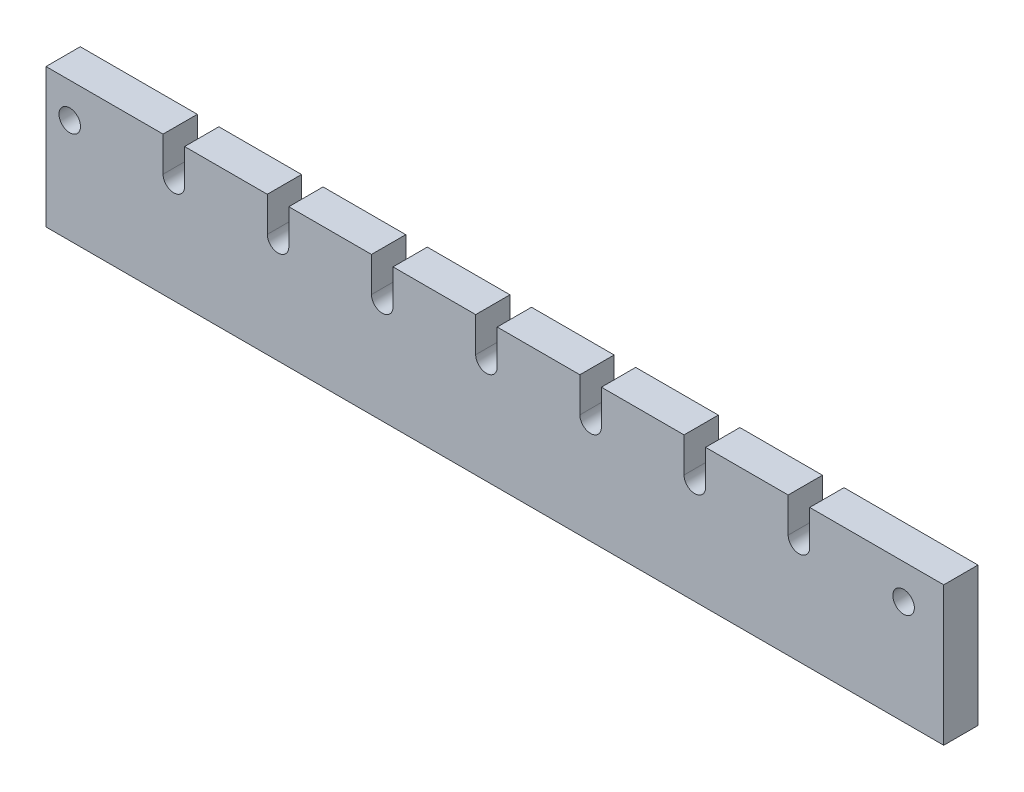
ISO-10303-21;
HEADER;
FILE_DESCRIPTION(('STEP AP214'),'2;1');
FILE_NAME('part.step','',(''),(''),'','','');
FILE_SCHEMA(('AUTOMOTIVE_DESIGN { 1 0 10303 214 1 1 1 1 }'));
ENDSEC;
DATA;
#1=APPLICATION_CONTEXT('core data for automotive mechanical design processes');
#2=APPLICATION_PROTOCOL_DEFINITION('international standard','automotive_design',2000,#1);
#3=PRODUCT_CONTEXT('',#1,'mechanical');
#4=PRODUCT('Part','Part','',(#3));
#5=PRODUCT_RELATED_PRODUCT_CATEGORY('part','',(#4));
#6=PRODUCT_DEFINITION_FORMATION('','',#4);
#7=PRODUCT_DEFINITION_CONTEXT('part definition',#1,'design');
#8=PRODUCT_DEFINITION('design','',#6,#7);
#9=PRODUCT_DEFINITION_SHAPE('','',#8);
#10=(LENGTH_UNIT() NAMED_UNIT(*) SI_UNIT(.MILLI.,.METRE.));
#11=(NAMED_UNIT(*) PLANE_ANGLE_UNIT() SI_UNIT($,.RADIAN.));
#12=(NAMED_UNIT(*) SI_UNIT($,.STERADIAN.) SOLID_ANGLE_UNIT());
#13=UNCERTAINTY_MEASURE_WITH_UNIT(LENGTH_MEASURE(1.E-05),#10,'distance_accuracy_value','');
#14=(GEOMETRIC_REPRESENTATION_CONTEXT(3) GLOBAL_UNCERTAINTY_ASSIGNED_CONTEXT((#13)) GLOBAL_UNIT_ASSIGNED_CONTEXT((#10,
#11,#12)) REPRESENTATION_CONTEXT('',''));
#15=CARTESIAN_POINT('',(0.,0.,0.));
#16=DIRECTION('',(0.,0.,1.));
#17=DIRECTION('',(1.,0.,0.));
#18=AXIS2_PLACEMENT_3D('',#15,#16,#17);
#19=CARTESIAN_POINT('',(-14.535440576,5.65,1.47955));
#20=DIRECTION('',(0.,-1.,0.));
#21=DIRECTION('',(1.,0.,0.));
#22=AXIS2_PLACEMENT_3D('',#19,#20,#21);
#23=PLANE('',#22);
#24=DIRECTION('',(-1.,0.,0.));
#25=VECTOR('',#24,1.);
#26=CARTESIAN_POINT('',(-14.535440576,5.65,-1.47955));
#27=LINE('',#26,#25);
#28=CARTESIAN_POINT('',(-54.948557695701,5.65,-1.47955));
#29=VERTEX_POINT('',#28);
#30=CARTESIAN_POINT('',(-62.0865766914609,5.65,-1.47955));
#31=VERTEX_POINT('',#30);
#32=EDGE_CURVE('E519',#29,#31,#27,.T.);
#33=ORIENTED_EDGE('',*,*,#32,.T.);
#34=DIRECTION('',(0.,0.,-1.));
#35=VECTOR('',#34,1.);
#36=CARTESIAN_POINT('',(-62.0865766914609,5.65,1.47955));
#37=LINE('',#36,#35);
#38=CARTESIAN_POINT('',(-62.0865766914609,5.65,1.47955));
#39=VERTEX_POINT('',#38);
#40=EDGE_CURVE('E331',#39,#31,#37,.T.);
#41=ORIENTED_EDGE('',*,*,#40,.F.);
#42=DIRECTION('',(-1.,0.,0.));
#43=VECTOR('',#42,1.);
#44=CARTESIAN_POINT('',(-14.535440576,5.65,1.47955));
#45=LINE('',#44,#43);
#46=CARTESIAN_POINT('',(-54.948557695701,5.65,1.47955));
#47=VERTEX_POINT('',#46);
#48=EDGE_CURVE('E559',#47,#39,#45,.T.);
#49=ORIENTED_EDGE('',*,*,#48,.F.);
#50=DIRECTION('',(0.,0.,-1.));
#51=VECTOR('',#50,1.);
#52=CARTESIAN_POINT('',(-54.948557695701,5.65,1.47955));
#53=LINE('',#52,#51);
#54=EDGE_CURVE('E309',#47,#29,#53,.T.);
#55=ORIENTED_EDGE('',*,*,#54,.T.);
#56=EDGE_LOOP('',(#33,#41,#49,#55));
#57=FACE_BOUND('',#56,.T.);
#58=ADVANCED_FACE('F43',(#57),#23,.F.);
#59=CARTESIAN_POINT('',(-45.9523375342107,5.65,-1.47955));
#60=VERTEX_POINT('',#59);
#61=CARTESIAN_POINT('',(-53.089277695701,5.65,-1.47955));
#62=VERTEX_POINT('',#61);
#63=EDGE_CURVE('E517',#60,#62,#27,.T.);
#64=ORIENTED_EDGE('',*,*,#63,.T.);
#65=DIRECTION('',(0.,0.,-1.));
#66=VECTOR('',#65,1.);
#67=CARTESIAN_POINT('',(-53.089277695701,5.65,1.47955));
#68=LINE('',#67,#66);
#69=CARTESIAN_POINT('',(-53.089277695701,5.65,1.47955));
#70=VERTEX_POINT('',#69);
#71=EDGE_CURVE('E313',#70,#62,#68,.T.);
#72=ORIENTED_EDGE('',*,*,#71,.F.);
#73=CARTESIAN_POINT('',(-45.9523375342107,5.65,1.47955));
#74=VERTEX_POINT('',#73);
#75=EDGE_CURVE('E511',#74,#70,#45,.T.);
#76=ORIENTED_EDGE('',*,*,#75,.F.);
#77=DIRECTION('',(0.,0.,-1.));
#78=VECTOR('',#77,1.);
#79=CARTESIAN_POINT('',(-45.9523375342107,5.65,1.47955));
#80=LINE('',#79,#78);
#81=EDGE_CURVE('E289',#74,#60,#80,.T.);
#82=ORIENTED_EDGE('',*,*,#81,.T.);
#83=EDGE_LOOP('',(#64,#72,#76,#82));
#84=FACE_BOUND('',#83,.T.);
#85=ADVANCED_FACE('F516',(#84),#23,.F.);
#86=CARTESIAN_POINT('',(-36.9580024401696,5.65,-1.47955));
#87=VERTEX_POINT('',#86);
#88=CARTESIAN_POINT('',(-44.0930575342107,5.65,-1.47955));
#89=VERTEX_POINT('',#88);
#90=EDGE_CURVE('E518',#87,#89,#27,.T.);
#91=ORIENTED_EDGE('',*,*,#90,.T.);
#92=DIRECTION('',(0.,0.,-1.));
#93=VECTOR('',#92,1.);
#94=CARTESIAN_POINT('',(-44.0930575342107,5.65,1.47955));
#95=LINE('',#94,#93);
#96=CARTESIAN_POINT('',(-44.0930575342107,5.65,1.47955));
#97=VERTEX_POINT('',#96);
#98=EDGE_CURVE('E293',#97,#89,#95,.T.);
#99=ORIENTED_EDGE('',*,*,#98,.F.);
#100=CARTESIAN_POINT('',(-36.9580024401696,5.65,1.47955));
#101=VERTEX_POINT('',#100);
#102=EDGE_CURVE('E561',#101,#97,#45,.T.);
#103=ORIENTED_EDGE('',*,*,#102,.F.);
#104=DIRECTION('',(0.,0.,-1.));
#105=VECTOR('',#104,1.);
#106=CARTESIAN_POINT('',(-36.9580024401696,5.65,1.47955));
#107=LINE('',#106,#105);
#108=EDGE_CURVE('E280',#101,#87,#107,.T.);
#109=ORIENTED_EDGE('',*,*,#108,.T.);
#110=EDGE_LOOP('',(#91,#99,#103,#109));
#111=FACE_BOUND('',#110,.T.);
#112=ADVANCED_FACE('F567',(#111),#23,.F.);
#113=CARTESIAN_POINT('',(-27.9674254001458,5.65,-1.47955));
#114=VERTEX_POINT('',#113);
#115=CARTESIAN_POINT('',(-35.0987224401695,5.65,-1.47955));
#116=VERTEX_POINT('',#115);
#117=EDGE_CURVE('E425',#114,#116,#27,.T.);
#118=ORIENTED_EDGE('',*,*,#117,.T.);
#119=DIRECTION('',(0.,0.,-1.));
#120=VECTOR('',#119,1.);
#121=CARTESIAN_POINT('',(-35.0987224401695,5.65,1.47955));
#122=LINE('',#121,#120);
#123=CARTESIAN_POINT('',(-35.0987224401695,5.65,1.47955));
#124=VERTEX_POINT('',#123);
#125=EDGE_CURVE('E257',#124,#116,#122,.T.);
#126=ORIENTED_EDGE('',*,*,#125,.F.);
#127=CARTESIAN_POINT('',(-27.9674254001458,5.65,1.47955));
#128=VERTEX_POINT('',#127);
#129=EDGE_CURVE('E277',#128,#124,#45,.T.);
#130=ORIENTED_EDGE('',*,*,#129,.F.);
#131=DIRECTION('',(0.,0.,-1.));
#132=VECTOR('',#131,1.);
#133=CARTESIAN_POINT('',(-27.9674254001458,5.65,1.47955));
#134=LINE('',#133,#132);
#135=EDGE_CURVE('E350',#128,#114,#134,.T.);
#136=ORIENTED_EDGE('',*,*,#135,.T.);
#137=EDGE_LOOP('',(#118,#126,#130,#136));
#138=FACE_BOUND('',#137,.T.);
#139=ADVANCED_FACE('F616',(#138),#23,.F.);
#140=CARTESIAN_POINT('',(-63.9458566914609,5.65,1.47955));
#141=VERTEX_POINT('',#140);
#142=CARTESIAN_POINT('',(-71.0845505180921,5.65,1.47955));
#143=VERTEX_POINT('',#142);
#144=EDGE_CURVE('E556',#141,#143,#45,.T.);
#145=ORIENTED_EDGE('',*,*,#144,.F.);
#146=DIRECTION('',(0.,0.,-1.));
#147=VECTOR('',#146,1.);
#148=CARTESIAN_POINT('',(-63.9458566914609,5.65,1.47955));
#149=LINE('',#148,#147);
#150=CARTESIAN_POINT('',(-63.9458566914609,5.65,-1.47955));
#151=VERTEX_POINT('',#150);
#152=EDGE_CURVE('E328',#141,#151,#149,.T.);
#153=ORIENTED_EDGE('',*,*,#152,.T.);
#154=CARTESIAN_POINT('',(-71.0845505180921,5.65,-1.47955));
#155=VERTEX_POINT('',#154);
#156=EDGE_CURVE('E522',#151,#155,#27,.T.);
#157=ORIENTED_EDGE('',*,*,#156,.T.);
#158=DIRECTION('',(0.,0.,-1.));
#159=VECTOR('',#158,1.);
#160=CARTESIAN_POINT('',(-71.0845505180921,5.65,1.47955));
#161=LINE('',#160,#159);
#162=EDGE_CURVE('E371',#143,#155,#161,.T.);
#163=ORIENTED_EDGE('',*,*,#162,.F.);
#164=EDGE_LOOP('',(#145,#153,#157,#163));
#165=FACE_BOUND('',#164,.T.);
#166=ADVANCED_FACE('F605',(#165),#23,.F.);
#167=CARTESIAN_POINT('',(-72.9438305180921,5.65,1.47955));
#168=VERTEX_POINT('',#167);
#169=CARTESIAN_POINT('',(-80.0829744503734,5.65,1.47955));
#170=VERTEX_POINT('',#169);
#171=EDGE_CURVE('E554',#168,#170,#45,.T.);
#172=ORIENTED_EDGE('',*,*,#171,.F.);
#173=DIRECTION('',(0.,0.,-1.));
#174=VECTOR('',#173,1.);
#175=CARTESIAN_POINT('',(-72.9438305180921,5.65,1.47955));
#176=LINE('',#175,#174);
#177=CARTESIAN_POINT('',(-72.9438305180921,5.65,-1.47955));
#178=VERTEX_POINT('',#177);
#179=EDGE_CURVE('E367',#168,#178,#176,.T.);
#180=ORIENTED_EDGE('',*,*,#179,.T.);
#181=CARTESIAN_POINT('',(-80.0829744503734,5.65,-1.47955));
#182=VERTEX_POINT('',#181);
#183=EDGE_CURVE('E526',#178,#182,#27,.T.);
#184=ORIENTED_EDGE('',*,*,#183,.T.);
#185=DIRECTION('',(0.,0.,-1.));
#186=VECTOR('',#185,1.);
#187=CARTESIAN_POINT('',(-80.0829744503734,5.65,1.47955));
#188=LINE('',#187,#186);
#189=EDGE_CURVE('E392',#170,#182,#188,.T.);
#190=ORIENTED_EDGE('',*,*,#189,.F.);
#191=EDGE_LOOP('',(#172,#180,#184,#190));
#192=FACE_BOUND('',#191,.T.);
#193=ADVANCED_FACE('F600',(#192),#23,.F.);
#194=CARTESIAN_POINT('',(-14.535440576,5.65,-1.47955));
#195=VERTEX_POINT('',#194);
#196=CARTESIAN_POINT('',(-26.1081454001458,5.65,-1.47955));
#197=VERTEX_POINT('',#196);
#198=EDGE_CURVE('E421',#195,#197,#27,.T.);
#199=ORIENTED_EDGE('',*,*,#198,.T.);
#200=DIRECTION('',(0.,0.,-1.));
#201=VECTOR('',#200,1.);
#202=CARTESIAN_POINT('',(-26.1081454001458,5.65,1.47955));
#203=LINE('',#202,#201);
#204=CARTESIAN_POINT('',(-26.1081454001458,5.65,1.47955));
#205=VERTEX_POINT('',#204);
#206=EDGE_CURVE('E353',#205,#197,#203,.T.);
#207=ORIENTED_EDGE('',*,*,#206,.F.);
#208=CARTESIAN_POINT('',(-14.535440576,5.65,1.47955));
#209=VERTEX_POINT('',#208);
#210=EDGE_CURVE('E408',#209,#205,#45,.T.);
#211=ORIENTED_EDGE('',*,*,#210,.F.);
#212=DIRECTION('',(0.,0.,-1.));
#213=VECTOR('',#212,1.);
#214=CARTESIAN_POINT('',(-14.535440576,5.65,1.47955));
#215=LINE('',#214,#213);
#216=EDGE_CURVE('E436',#209,#195,#215,.T.);
#217=ORIENTED_EDGE('',*,*,#216,.T.);
#218=EDGE_LOOP('',(#199,#207,#211,#217));
#219=FACE_BOUND('',#218,.T.);
#220=ADVANCED_FACE('F593',(#219),#23,.F.);
#221=CARTESIAN_POINT('',(-14.535440576,-6.35,1.47955));
#222=DIRECTION('',(-1.,0.,0.));
#223=DIRECTION('',(0.,-1.,0.));
#224=AXIS2_PLACEMENT_3D('',#221,#222,#223);
#225=PLANE('',#224);
#226=DIRECTION('',(0.,1.,0.));
#227=VECTOR('',#226,1.);
#228=CARTESIAN_POINT('',(-14.535440576,-6.35,-1.47955));
#229=LINE('',#228,#227);
#230=CARTESIAN_POINT('',(-14.535440576,-6.35,-1.47955));
#231=VERTEX_POINT('',#230);
#232=EDGE_CURVE('E416',#231,#195,#229,.T.);
#233=ORIENTED_EDGE('',*,*,#232,.T.);
#234=ORIENTED_EDGE('',*,*,#216,.F.);
#235=DIRECTION('',(0.,1.,0.));
#236=VECTOR('',#235,1.);
#237=CARTESIAN_POINT('',(-14.535440576,-6.35,1.47955));
#238=LINE('',#237,#236);
#239=CARTESIAN_POINT('',(-14.535440576,-6.35,1.47955));
#240=VERTEX_POINT('',#239);
#241=EDGE_CURVE('E403',#240,#209,#238,.T.);
#242=ORIENTED_EDGE('',*,*,#241,.F.);
#243=DIRECTION('',(0.,0.,-1.));
#244=VECTOR('',#243,1.);
#245=CARTESIAN_POINT('',(-14.535440576,-6.35,1.47955));
#246=LINE('',#245,#244);
#247=EDGE_CURVE('E415',#240,#231,#246,.T.);
#248=ORIENTED_EDGE('',*,*,#247,.T.);
#249=EDGE_LOOP('',(#233,#234,#242,#248));
#250=FACE_BOUND('',#249,.T.);
#251=ADVANCED_FACE('F45',(#250),#225,.F.);
#252=CARTESIAN_POINT('',(-81.9422544503734,5.64999999999999,1.47955));
#253=VERTEX_POINT('',#252);
#254=CARTESIAN_POINT('',(-92.050002844,5.64999999999999,1.47955));
#255=VERTEX_POINT('',#254);
#256=EDGE_CURVE('E406',#253,#255,#45,.T.);
#257=ORIENTED_EDGE('',*,*,#256,.F.);
#258=DIRECTION('',(0.,0.,-1.));
#259=VECTOR('',#258,1.);
#260=CARTESIAN_POINT('',(-81.9422544503734,5.64999999999999,1.47955));
#261=LINE('',#260,#259);
#262=CARTESIAN_POINT('',(-81.9422544503734,5.64999999999999,-1.47955));
#263=VERTEX_POINT('',#262);
#264=EDGE_CURVE('E389',#253,#263,#261,.T.);
#265=ORIENTED_EDGE('',*,*,#264,.T.);
#266=CARTESIAN_POINT('',(-92.050002844,5.64999999999999,-1.47955));
#267=VERTEX_POINT('',#266);
#268=EDGE_CURVE('E419',#263,#267,#27,.T.);
#269=ORIENTED_EDGE('',*,*,#268,.T.);
#270=DIRECTION('',(0.,0.,-1.));
#271=VECTOR('',#270,1.);
#272=CARTESIAN_POINT('',(-92.050002844,5.64999999999999,1.47955));
#273=LINE('',#272,#271);
#274=EDGE_CURVE('E433',#255,#267,#273,.T.);
#275=ORIENTED_EDGE('',*,*,#274,.F.);
#276=EDGE_LOOP('',(#257,#265,#269,#275));
#277=FACE_BOUND('',#276,.T.);
#278=ADVANCED_FACE('F538',(#277),#23,.F.);
#279=CARTESIAN_POINT('',(-92.050002844,-6.35000000000001,1.47955));
#280=DIRECTION('',(1.,0.,0.));
#281=DIRECTION('',(0.,0.,-1.));
#282=AXIS2_PLACEMENT_3D('',#279,#280,#281);
#283=PLANE('',#282);
#284=DIRECTION('',(0.,-1.,0.));
#285=VECTOR('',#284,1.);
#286=CARTESIAN_POINT('',(-92.050002844,-6.35000000000001,-1.47955));
#287=LINE('',#286,#285);
#288=CARTESIAN_POINT('',(-92.050002844,-6.35000000000001,-1.47955));
#289=VERTEX_POINT('',#288);
#290=EDGE_CURVE('E424',#267,#289,#287,.T.);
#291=ORIENTED_EDGE('',*,*,#290,.T.);
#292=DIRECTION('',(0.,0.,-1.));
#293=VECTOR('',#292,1.);
#294=CARTESIAN_POINT('',(-92.050002844,-6.35000000000001,1.47955));
#295=LINE('',#294,#293);
#296=CARTESIAN_POINT('',(-92.050002844,-6.35000000000001,1.47955));
#297=VERTEX_POINT('',#296);
#298=EDGE_CURVE('E430',#297,#289,#295,.T.);
#299=ORIENTED_EDGE('',*,*,#298,.F.);
#300=DIRECTION('',(0.,-1.,0.));
#301=VECTOR('',#300,1.);
#302=CARTESIAN_POINT('',(-92.050002844,-6.35000000000001,1.47955));
#303=LINE('',#302,#301);
#304=EDGE_CURVE('E411',#255,#297,#303,.T.);
#305=ORIENTED_EDGE('',*,*,#304,.F.);
#306=ORIENTED_EDGE('',*,*,#274,.T.);
#307=EDGE_LOOP('',(#291,#299,#305,#306));
#308=FACE_BOUND('',#307,.T.);
#309=ADVANCED_FACE('F542',(#308),#283,.F.);
#310=CARTESIAN_POINT('',(-14.535440576,-6.35,1.47955));
#311=DIRECTION('',(0.,1.,0.));
#312=DIRECTION('',(-1.,0.,0.));
#313=AXIS2_PLACEMENT_3D('',#310,#311,#312);
#314=PLANE('',#313);
#315=DIRECTION('',(1.,0.,0.));
#316=VECTOR('',#315,1.);
#317=CARTESIAN_POINT('',(-14.535440576,-6.35,-1.47955));
#318=LINE('',#317,#316);
#319=EDGE_CURVE('E407',#289,#231,#318,.T.);
#320=ORIENTED_EDGE('',*,*,#319,.T.);
#321=ORIENTED_EDGE('',*,*,#247,.F.);
#322=DIRECTION('',(1.,0.,0.));
#323=VECTOR('',#322,1.);
#324=CARTESIAN_POINT('',(-14.535440576,-6.35,1.47955));
#325=LINE('',#324,#323);
#326=EDGE_CURVE('E413',#297,#240,#325,.T.);
#327=ORIENTED_EDGE('',*,*,#326,.F.);
#328=ORIENTED_EDGE('',*,*,#298,.T.);
#329=EDGE_LOOP('',(#320,#321,#327,#328));
#330=FACE_BOUND('',#329,.T.);
#331=ADVANCED_FACE('F548',(#330),#314,.F.);
#332=CARTESIAN_POINT('',(0.,0.,1.47955));
#333=DIRECTION('',(0.,0.,1.));
#334=DIRECTION('',(1.,0.,0.));
#335=AXIS2_PLACEMENT_3D('',#332,#333,#334);
#336=PLANE('',#335);
#337=CARTESIAN_POINT('',(-18.000000576,2.65,1.47955));
#338=DIRECTION('',(0.,0.,-1.));
#339=DIRECTION('',(-1.,0.,0.));
#340=AXIS2_PLACEMENT_3D('',#337,#338,#339);
#341=CIRCLE('',#340,0.929639999999999);
#342=CARTESIAN_POINT('',(-18.929640576,2.65,1.47955));
#343=VERTEX_POINT('',#342);
#344=EDGE_CURVE('E384',#343,#343,#341,.T.);
#345=ORIENTED_EDGE('',*,*,#344,.T.);
#346=EDGE_LOOP('',(#345));
#347=FACE_BOUND('',#346,.T.);
#348=DIRECTION('',(0.,-1.,0.));
#349=VECTOR('',#348,1.);
#350=CARTESIAN_POINT('',(-62.0865766914609,2.65,1.47955));
#351=LINE('',#350,#349);
#352=CARTESIAN_POINT('',(-62.0865766914609,2.65,1.47955));
#353=VERTEX_POINT('',#352);
#354=EDGE_CURVE('E327',#39,#353,#351,.T.);
#355=ORIENTED_EDGE('',*,*,#354,.T.);
#356=CARTESIAN_POINT('',(-63.0162166914609,2.65,1.47955));
#357=DIRECTION('',(0.,0.,-1.));
#358=DIRECTION('',(-1.,0.,0.));
#359=AXIS2_PLACEMENT_3D('',#356,#357,#358);
#360=CIRCLE('',#359,0.929639999999999);
#361=CARTESIAN_POINT('',(-63.9458566914609,2.65,1.47955));
#362=VERTEX_POINT('',#361);
#363=EDGE_CURVE('E314',#353,#362,#360,.T.);
#364=ORIENTED_EDGE('',*,*,#363,.T.);
#365=DIRECTION('',(0.,1.,0.));
#366=VECTOR('',#365,1.);
#367=CARTESIAN_POINT('',(-63.9458566914609,5.65,1.47955));
#368=LINE('',#367,#366);
#369=EDGE_CURVE('E336',#362,#141,#368,.T.);
#370=ORIENTED_EDGE('',*,*,#369,.T.);
#371=ORIENTED_EDGE('',*,*,#144,.T.);
#372=DIRECTION('',(0.,-1.,0.));
#373=VECTOR('',#372,1.);
#374=CARTESIAN_POINT('',(-71.0845505180921,2.65,1.47955));
#375=LINE('',#374,#373);
#376=CARTESIAN_POINT('',(-71.0845505180921,2.65,1.47955));
#377=VERTEX_POINT('',#376);
#378=EDGE_CURVE('E366',#143,#377,#375,.T.);
#379=ORIENTED_EDGE('',*,*,#378,.T.);
#380=CARTESIAN_POINT('',(-72.0141905180921,2.65,1.47955));
#381=DIRECTION('',(0.,0.,-1.));
#382=DIRECTION('',(-1.,0.,0.));
#383=AXIS2_PLACEMENT_3D('',#380,#381,#382);
#384=CIRCLE('',#383,0.929639999999995);
#385=CARTESIAN_POINT('',(-72.9438305180921,2.65,1.47955));
#386=VERTEX_POINT('',#385);
#387=EDGE_CURVE('E381',#377,#386,#384,.T.);
#388=ORIENTED_EDGE('',*,*,#387,.T.);
#389=DIRECTION('',(0.,1.,0.));
#390=VECTOR('',#389,1.);
#391=CARTESIAN_POINT('',(-72.9438305180921,5.65,1.47955));
#392=LINE('',#391,#390);
#393=EDGE_CURVE('E378',#386,#168,#392,.T.);
#394=ORIENTED_EDGE('',*,*,#393,.T.);
#395=ORIENTED_EDGE('',*,*,#171,.T.);
#396=DIRECTION('',(0.,-1.,0.));
#397=VECTOR('',#396,1.);
#398=CARTESIAN_POINT('',(-80.0829744503734,2.65,1.47955));
#399=LINE('',#398,#397);
#400=CARTESIAN_POINT('',(-80.0829744503734,2.65,1.47955));
#401=VERTEX_POINT('',#400);
#402=EDGE_CURVE('E388',#170,#401,#399,.T.);
#403=ORIENTED_EDGE('',*,*,#402,.T.);
#404=CARTESIAN_POINT('',(-81.0126144503734,2.65,1.47955));
#405=DIRECTION('',(0.,0.,-1.));
#406=DIRECTION('',(-1.,0.,0.));
#407=AXIS2_PLACEMENT_3D('',#404,#405,#406);
#408=CIRCLE('',#407,0.929639999999995);
#409=CARTESIAN_POINT('',(-81.9422544503734,2.65,1.47955));
#410=VERTEX_POINT('',#409);
#411=EDGE_CURVE('E372',#401,#410,#408,.T.);
#412=ORIENTED_EDGE('',*,*,#411,.T.);
#413=DIRECTION('',(0.,1.,0.));
#414=VECTOR('',#413,1.);
#415=CARTESIAN_POINT('',(-81.9422544503734,5.64999999999999,1.47955));
#416=LINE('',#415,#414);
#417=EDGE_CURVE('E398',#410,#253,#416,.T.);
#418=ORIENTED_EDGE('',*,*,#417,.T.);
#419=ORIENTED_EDGE('',*,*,#256,.T.);
#420=ORIENTED_EDGE('',*,*,#304,.T.);
#421=ORIENTED_EDGE('',*,*,#326,.T.);
#422=ORIENTED_EDGE('',*,*,#241,.T.);
#423=ORIENTED_EDGE('',*,*,#210,.T.);
#424=DIRECTION('',(0.,-1.,0.));
#425=VECTOR('',#424,1.);
#426=CARTESIAN_POINT('',(-26.1081454001458,2.65,1.47955));
#427=LINE('',#426,#425);
#428=CARTESIAN_POINT('',(-26.1081454001458,2.65,1.47955));
#429=VERTEX_POINT('',#428);
#430=EDGE_CURVE('E349',#205,#429,#427,.T.);
#431=ORIENTED_EDGE('',*,*,#430,.T.);
#432=CARTESIAN_POINT('',(-27.0377854001458,2.65,1.47955));
#433=DIRECTION('',(0.,0.,-1.));
#434=DIRECTION('',(-1.,0.,0.));
#435=AXIS2_PLACEMENT_3D('',#432,#433,#434);
#436=CIRCLE('',#435,0.929639999999999);
#437=CARTESIAN_POINT('',(-27.9674254001458,2.65,1.47955));
#438=VERTEX_POINT('',#437);
#439=EDGE_CURVE('E345',#429,#438,#436,.T.);
#440=ORIENTED_EDGE('',*,*,#439,.T.);
#441=DIRECTION('',(0.,1.,0.));
#442=VECTOR('',#441,1.);
#443=CARTESIAN_POINT('',(-27.9674254001458,5.65,1.47955));
#444=LINE('',#443,#442);
#445=EDGE_CURVE('E359',#438,#128,#444,.T.);
#446=ORIENTED_EDGE('',*,*,#445,.T.);
#447=ORIENTED_EDGE('',*,*,#129,.T.);
#448=DIRECTION('',(0.,-1.,0.));
#449=VECTOR('',#448,1.);
#450=CARTESIAN_POINT('',(-35.0987224401695,2.65,1.47955));
#451=LINE('',#450,#449);
#452=CARTESIAN_POINT('',(-35.0987224401695,2.65,1.47955));
#453=VERTEX_POINT('',#452);
#454=EDGE_CURVE('E251',#124,#453,#451,.T.);
#455=ORIENTED_EDGE('',*,*,#454,.T.);
#456=CARTESIAN_POINT('',(-36.0283624401695,2.65,1.47955));
#457=DIRECTION('',(0.,0.,-1.));
#458=DIRECTION('',(-1.,0.,0.));
#459=AXIS2_PLACEMENT_3D('',#456,#457,#458);
#460=CIRCLE('',#459,0.929640000000002);
#461=CARTESIAN_POINT('',(-36.9580024401696,2.65,1.47955));
#462=VERTEX_POINT('',#461);
#463=EDGE_CURVE('E261',#453,#462,#460,.T.);
#464=ORIENTED_EDGE('',*,*,#463,.T.);
#465=DIRECTION('',(0.,1.,0.));
#466=VECTOR('',#465,1.);
#467=CARTESIAN_POINT('',(-36.9580024401696,5.65,1.47955));
#468=LINE('',#467,#466);
#469=EDGE_CURVE('E269',#462,#101,#468,.T.);
#470=ORIENTED_EDGE('',*,*,#469,.T.);
#471=ORIENTED_EDGE('',*,*,#102,.T.);
#472=DIRECTION('',(0.,-1.,0.));
#473=VECTOR('',#472,1.);
#474=CARTESIAN_POINT('',(-44.0930575342107,2.65,1.47955));
#475=LINE('',#474,#473);
#476=CARTESIAN_POINT('',(-44.0930575342107,2.65,1.47955));
#477=VERTEX_POINT('',#476);
#478=EDGE_CURVE('E288',#97,#477,#475,.T.);
#479=ORIENTED_EDGE('',*,*,#478,.T.);
#480=CARTESIAN_POINT('',(-45.0226975342107,2.65,1.47955));
#481=DIRECTION('',(0.,0.,-1.));
#482=DIRECTION('',(-1.,0.,0.));
#483=AXIS2_PLACEMENT_3D('',#480,#481,#482);
#484=CIRCLE('',#483,0.929640000000002);
#485=CARTESIAN_POINT('',(-45.9523375342107,2.65,1.47955));
#486=VERTEX_POINT('',#485);
#487=EDGE_CURVE('E258',#477,#486,#484,.T.);
#488=ORIENTED_EDGE('',*,*,#487,.T.);
#489=DIRECTION('',(0.,1.,0.));
#490=VECTOR('',#489,1.);
#491=CARTESIAN_POINT('',(-45.9523375342107,5.65,1.47955));
#492=LINE('',#491,#490);
#493=EDGE_CURVE('E300',#486,#74,#492,.T.);
#494=ORIENTED_EDGE('',*,*,#493,.T.);
#495=ORIENTED_EDGE('',*,*,#75,.T.);
#496=DIRECTION('',(0.,-1.,0.));
#497=VECTOR('',#496,1.);
#498=CARTESIAN_POINT('',(-53.089277695701,2.65,1.47955));
#499=LINE('',#498,#497);
#500=CARTESIAN_POINT('',(-53.089277695701,2.65,1.47955));
#501=VERTEX_POINT('',#500);
#502=EDGE_CURVE('E308',#70,#501,#499,.T.);
#503=ORIENTED_EDGE('',*,*,#502,.T.);
#504=CARTESIAN_POINT('',(-54.018917695701,2.65,1.47955));
#505=DIRECTION('',(0.,0.,-1.));
#506=DIRECTION('',(-1.,0.,0.));
#507=AXIS2_PLACEMENT_3D('',#504,#505,#506);
#508=CIRCLE('',#507,0.929640000000002);
#509=CARTESIAN_POINT('',(-54.948557695701,2.65,1.47955));
#510=VERTEX_POINT('',#509);
#511=EDGE_CURVE('E294',#501,#510,#508,.T.);
#512=ORIENTED_EDGE('',*,*,#511,.T.);
#513=DIRECTION('',(0.,1.,0.));
#514=VECTOR('',#513,1.);
#515=CARTESIAN_POINT('',(-54.948557695701,5.65,1.47955));
#516=LINE('',#515,#514);
#517=EDGE_CURVE('E320',#510,#47,#516,.T.);
#518=ORIENTED_EDGE('',*,*,#517,.T.);
#519=ORIENTED_EDGE('',*,*,#48,.T.);
#520=EDGE_LOOP('',(#355,#364,#370,#371,#379,#388,#394,#395,#403,#412,#418,#419,#420,#421,#422,
#423,#431,#440,#446,#447,#455,#464,#470,#471,#479,#488,#494,#495,#503,#512,#518,#519));
#521=FACE_BOUND('',#520,.T.);
#522=CARTESIAN_POINT('',(-90.00000288,2.65,1.47955));
#523=DIRECTION('',(0.,0.,-1.));
#524=DIRECTION('',(-1.,0.,0.));
#525=AXIS2_PLACEMENT_3D('',#522,#523,#524);
#526=CIRCLE('',#525,0.929639999999999);
#527=CARTESIAN_POINT('',(-90.92964288,2.65,1.47955));
#528=VERTEX_POINT('',#527);
#529=EDGE_CURVE('E341',#528,#528,#526,.T.);
#530=ORIENTED_EDGE('',*,*,#529,.T.);
#531=EDGE_LOOP('',(#530));
#532=FACE_BOUND('',#531,.T.);
#533=ADVANCED_FACE('F273',(#347,#521,#532),#336,.T.);
#534=CARTESIAN_POINT('',(0.,0.,-1.47955));
#535=DIRECTION('',(0.,0.,1.));
#536=DIRECTION('',(1.,0.,0.));
#537=AXIS2_PLACEMENT_3D('',#534,#535,#536);
#538=PLANE('',#537);
#539=CARTESIAN_POINT('',(-18.000000576,2.65,-1.47955));
#540=DIRECTION('',(0.,0.,1.));
#541=DIRECTION('',(1.,0.,0.));
#542=AXIS2_PLACEMENT_3D('',#539,#540,#541);
#543=CIRCLE('',#542,0.929639999999999);
#544=CARTESIAN_POINT('',(-17.070360576,2.65,-1.47955));
#545=VERTEX_POINT('',#544);
#546=EDGE_CURVE('E420',#545,#545,#543,.T.);
#547=ORIENTED_EDGE('',*,*,#546,.T.);
#548=EDGE_LOOP('',(#547));
#549=FACE_BOUND('',#548,.T.);
#550=CARTESIAN_POINT('',(-90.00000288,2.65,-1.47955));
#551=DIRECTION('',(0.,0.,1.));
#552=DIRECTION('',(1.,0.,0.));
#553=AXIS2_PLACEMENT_3D('',#550,#551,#552);
#554=CIRCLE('',#553,0.929639999999999);
#555=CARTESIAN_POINT('',(-89.07036288,2.65,-1.47955));
#556=VERTEX_POINT('',#555);
#557=EDGE_CURVE('E447',#556,#556,#554,.T.);
#558=ORIENTED_EDGE('',*,*,#557,.T.);
#559=EDGE_LOOP('',(#558));
#560=FACE_BOUND('',#559,.T.);
#561=CARTESIAN_POINT('',(-63.0162166914609,2.65,-1.47955));
#562=DIRECTION('',(0.,0.,-1.));
#563=DIRECTION('',(-1.,0.,0.));
#564=AXIS2_PLACEMENT_3D('',#561,#562,#563);
#565=CIRCLE('',#564,0.929639999999999);
#566=CARTESIAN_POINT('',(-63.9458566914609,2.65,-1.47955));
#567=VERTEX_POINT('',#566);
#568=CARTESIAN_POINT('',(-62.0865766914609,2.65,-1.47955));
#569=VERTEX_POINT('',#568);
#570=EDGE_CURVE('E47',#567,#569,#565,.F.);
#571=ORIENTED_EDGE('',*,*,#570,.T.);
#572=DIRECTION('',(0.,1.,0.));
#573=VECTOR('',#572,1.);
#574=CARTESIAN_POINT('',(-62.0865766914609,0.,-1.47955));
#575=LINE('',#574,#573);
#576=EDGE_CURVE('E11',#569,#31,#575,.T.);
#577=ORIENTED_EDGE('',*,*,#576,.T.);
#578=ORIENTED_EDGE('',*,*,#32,.F.);
#579=DIRECTION('',(0.,-1.,0.));
#580=VECTOR('',#579,1.);
#581=CARTESIAN_POINT('',(-54.948557695701,0.,-1.47955));
#582=LINE('',#581,#580);
#583=CARTESIAN_POINT('',(-54.948557695701,2.65,-1.47955));
#584=VERTEX_POINT('',#583);
#585=EDGE_CURVE('E475',#29,#584,#582,.T.);
#586=ORIENTED_EDGE('',*,*,#585,.T.);
#587=CARTESIAN_POINT('',(-54.018917695701,2.65,-1.47955));
#588=DIRECTION('',(0.,0.,-1.));
#589=DIRECTION('',(-1.,0.,0.));
#590=AXIS2_PLACEMENT_3D('',#587,#588,#589);
#591=CIRCLE('',#590,0.929640000000002);
#592=CARTESIAN_POINT('',(-53.089277695701,2.65,-1.47955));
#593=VERTEX_POINT('',#592);
#594=EDGE_CURVE('E478',#584,#593,#591,.F.);
#595=ORIENTED_EDGE('',*,*,#594,.T.);
#596=DIRECTION('',(0.,1.,0.));
#597=VECTOR('',#596,1.);
#598=CARTESIAN_POINT('',(-53.089277695701,0.,-1.47955));
#599=LINE('',#598,#597);
#600=EDGE_CURVE('E479',#593,#62,#599,.T.);
#601=ORIENTED_EDGE('',*,*,#600,.T.);
#602=ORIENTED_EDGE('',*,*,#63,.F.);
#603=DIRECTION('',(0.,-1.,0.));
#604=VECTOR('',#603,1.);
#605=CARTESIAN_POINT('',(-45.9523375342107,0.,-1.47955));
#606=LINE('',#605,#604);
#607=CARTESIAN_POINT('',(-45.9523375342107,2.65,-1.47955));
#608=VERTEX_POINT('',#607);
#609=EDGE_CURVE('E468',#60,#608,#606,.T.);
#610=ORIENTED_EDGE('',*,*,#609,.T.);
#611=CARTESIAN_POINT('',(-45.0226975342107,2.65,-1.47955));
#612=DIRECTION('',(0.,0.,-1.));
#613=DIRECTION('',(-1.,0.,0.));
#614=AXIS2_PLACEMENT_3D('',#611,#612,#613);
#615=CIRCLE('',#614,0.929640000000002);
#616=CARTESIAN_POINT('',(-44.0930575342107,2.65,-1.47955));
#617=VERTEX_POINT('',#616);
#618=EDGE_CURVE('E471',#608,#617,#615,.F.);
#619=ORIENTED_EDGE('',*,*,#618,.T.);
#620=DIRECTION('',(0.,1.,0.));
#621=VECTOR('',#620,1.);
#622=CARTESIAN_POINT('',(-44.0930575342107,0.,-1.47955));
#623=LINE('',#622,#621);
#624=EDGE_CURVE('E472',#617,#89,#623,.T.);
#625=ORIENTED_EDGE('',*,*,#624,.T.);
#626=ORIENTED_EDGE('',*,*,#90,.F.);
#627=DIRECTION('',(0.,-1.,0.));
#628=VECTOR('',#627,1.);
#629=CARTESIAN_POINT('',(-36.9580024401696,0.,-1.47955));
#630=LINE('',#629,#628);
#631=CARTESIAN_POINT('',(-36.9580024401696,2.65,-1.47955));
#632=VERTEX_POINT('',#631);
#633=EDGE_CURVE('E463',#87,#632,#630,.T.);
#634=ORIENTED_EDGE('',*,*,#633,.T.);
#635=CARTESIAN_POINT('',(-36.0283624401695,2.65,-1.47955));
#636=DIRECTION('',(0.,0.,-1.));
#637=DIRECTION('',(-1.,0.,0.));
#638=AXIS2_PLACEMENT_3D('',#635,#636,#637);
#639=CIRCLE('',#638,0.929640000000002);
#640=CARTESIAN_POINT('',(-35.0987224401695,2.65,-1.47955));
#641=VERTEX_POINT('',#640);
#642=EDGE_CURVE('E466',#632,#641,#639,.F.);
#643=ORIENTED_EDGE('',*,*,#642,.T.);
#644=DIRECTION('',(0.,1.,0.));
#645=VECTOR('',#644,1.);
#646=CARTESIAN_POINT('',(-35.0987224401695,0.,-1.47955));
#647=LINE('',#646,#645);
#648=EDGE_CURVE('E254',#641,#116,#647,.T.);
#649=ORIENTED_EDGE('',*,*,#648,.T.);
#650=ORIENTED_EDGE('',*,*,#117,.F.);
#651=DIRECTION('',(0.,-1.,0.));
#652=VECTOR('',#651,1.);
#653=CARTESIAN_POINT('',(-27.9674254001458,0.,-1.47955));
#654=LINE('',#653,#652);
#655=CARTESIAN_POINT('',(-27.9674254001458,2.65,-1.47955));
#656=VERTEX_POINT('',#655);
#657=EDGE_CURVE('E439',#114,#656,#654,.T.);
#658=ORIENTED_EDGE('',*,*,#657,.T.);
#659=CARTESIAN_POINT('',(-27.0377854001458,2.65,-1.47955));
#660=DIRECTION('',(0.,0.,-1.));
#661=DIRECTION('',(-1.,0.,0.));
#662=AXIS2_PLACEMENT_3D('',#659,#660,#661);
#663=CIRCLE('',#662,0.929639999999999);
#664=CARTESIAN_POINT('',(-26.1081454001458,2.65,-1.47955));
#665=VERTEX_POINT('',#664);
#666=EDGE_CURVE('E442',#656,#665,#663,.F.);
#667=ORIENTED_EDGE('',*,*,#666,.T.);
#668=DIRECTION('',(0.,1.,0.));
#669=VECTOR('',#668,1.);
#670=CARTESIAN_POINT('',(-26.1081454001458,0.,-1.47955));
#671=LINE('',#670,#669);
#672=EDGE_CURVE('E443',#665,#197,#671,.T.);
#673=ORIENTED_EDGE('',*,*,#672,.T.);
#674=ORIENTED_EDGE('',*,*,#198,.F.);
#675=ORIENTED_EDGE('',*,*,#232,.F.);
#676=ORIENTED_EDGE('',*,*,#319,.F.);
#677=ORIENTED_EDGE('',*,*,#290,.F.);
#678=ORIENTED_EDGE('',*,*,#268,.F.);
#679=DIRECTION('',(0.,-1.,0.));
#680=VECTOR('',#679,1.);
#681=CARTESIAN_POINT('',(-81.9422544503734,0.,-1.47955));
#682=LINE('',#681,#680);
#683=CARTESIAN_POINT('',(-81.9422544503734,2.65,-1.47955));
#684=VERTEX_POINT('',#683);
#685=EDGE_CURVE('E446',#263,#684,#682,.T.);
#686=ORIENTED_EDGE('',*,*,#685,.T.);
#687=CARTESIAN_POINT('',(-81.0126144503734,2.65,-1.47955));
#688=DIRECTION('',(0.,0.,-1.));
#689=DIRECTION('',(-1.,0.,0.));
#690=AXIS2_PLACEMENT_3D('',#687,#688,#689);
#691=CIRCLE('',#690,0.929639999999995);
#692=CARTESIAN_POINT('',(-80.0829744503734,2.65,-1.47955));
#693=VERTEX_POINT('',#692);
#694=EDGE_CURVE('E452',#684,#693,#691,.F.);
#695=ORIENTED_EDGE('',*,*,#694,.T.);
#696=DIRECTION('',(0.,1.,0.));
#697=VECTOR('',#696,1.);
#698=CARTESIAN_POINT('',(-80.0829744503734,0.,-1.47955));
#699=LINE('',#698,#697);
#700=EDGE_CURVE('E453',#693,#182,#699,.T.);
#701=ORIENTED_EDGE('',*,*,#700,.T.);
#702=ORIENTED_EDGE('',*,*,#183,.F.);
#703=DIRECTION('',(0.,-1.,0.));
#704=VECTOR('',#703,1.);
#705=CARTESIAN_POINT('',(-72.9438305180921,0.,-1.47955));
#706=LINE('',#705,#704);
#707=CARTESIAN_POINT('',(-72.9438305180921,2.65,-1.47955));
#708=VERTEX_POINT('',#707);
#709=EDGE_CURVE('E456',#178,#708,#706,.T.);
#710=ORIENTED_EDGE('',*,*,#709,.T.);
#711=CARTESIAN_POINT('',(-72.0141905180921,2.65,-1.47955));
#712=DIRECTION('',(0.,0.,-1.));
#713=DIRECTION('',(-1.,0.,0.));
#714=AXIS2_PLACEMENT_3D('',#711,#712,#713);
#715=CIRCLE('',#714,0.929639999999995);
#716=CARTESIAN_POINT('',(-71.0845505180921,2.65,-1.47955));
#717=VERTEX_POINT('',#716);
#718=EDGE_CURVE('E459',#708,#717,#715,.F.);
#719=ORIENTED_EDGE('',*,*,#718,.T.);
#720=DIRECTION('',(0.,1.,0.));
#721=VECTOR('',#720,1.);
#722=CARTESIAN_POINT('',(-71.0845505180921,0.,-1.47955));
#723=LINE('',#722,#721);
#724=EDGE_CURVE('E460',#717,#155,#723,.T.);
#725=ORIENTED_EDGE('',*,*,#724,.T.);
#726=ORIENTED_EDGE('',*,*,#156,.F.);
#727=DIRECTION('',(0.,-1.,0.));
#728=VECTOR('',#727,1.);
#729=CARTESIAN_POINT('',(-63.9458566914609,0.,-1.47955));
#730=LINE('',#729,#728);
#731=EDGE_CURVE('E482',#151,#567,#730,.T.);
#732=ORIENTED_EDGE('',*,*,#731,.T.);
#733=EDGE_LOOP('',(#571,#577,#578,#586,#595,#601,#602,#610,#619,#625,#626,#634,#643,#649,#650,
#658,#667,#673,#674,#675,#676,#677,#678,#686,#695,#701,#702,#710,#719,#725,#726,#732));
#734=FACE_BOUND('',#733,.T.);
#735=ADVANCED_FACE('F497',(#549,#560,#734),#538,.F.);
#736=CARTESIAN_POINT('',(-27.0377854001458,2.65,1.47955));
#737=DIRECTION('',(0.,0.,-1.));
#738=DIRECTION('',(-1.,0.,0.));
#739=AXIS2_PLACEMENT_3D('',#736,#737,#738);
#740=CYLINDRICAL_SURFACE('',#739,0.929639999999999);
#741=DIRECTION('',(0.,0.,-1.));
#742=VECTOR('',#741,1.);
#743=CARTESIAN_POINT('',(-27.9674254001458,2.65,1.47955));
#744=LINE('',#743,#742);
#745=EDGE_CURVE('E346',#438,#656,#744,.T.);
#746=ORIENTED_EDGE('',*,*,#745,.F.);
#747=ORIENTED_EDGE('',*,*,#439,.F.);
#748=DIRECTION('',(0.,0.,-1.));
#749=VECTOR('',#748,1.);
#750=CARTESIAN_POINT('',(-26.1081454001458,2.65,1.47955));
#751=LINE('',#750,#749);
#752=EDGE_CURVE('E268',#429,#665,#751,.T.);
#753=ORIENTED_EDGE('',*,*,#752,.T.);
#754=ORIENTED_EDGE('',*,*,#666,.F.);
#755=EDGE_LOOP('',(#746,#747,#753,#754));
#756=FACE_BOUND('',#755,.T.);
#757=ADVANCED_FACE('F611',(#756),#740,.F.);
#758=CARTESIAN_POINT('',(-26.1081454001458,2.65,1.47955));
#759=DIRECTION('',(1.,0.,0.));
#760=DIRECTION('',(0.,0.,-1.));
#761=AXIS2_PLACEMENT_3D('',#758,#759,#760);
#762=PLANE('',#761);
#763=ORIENTED_EDGE('',*,*,#752,.F.);
#764=ORIENTED_EDGE('',*,*,#430,.F.);
#765=ORIENTED_EDGE('',*,*,#206,.T.);
#766=ORIENTED_EDGE('',*,*,#672,.F.);
#767=EDGE_LOOP('',(#763,#764,#765,#766));
#768=FACE_BOUND('',#767,.T.);
#769=ADVANCED_FACE('F608',(#768),#762,.F.);
#770=CARTESIAN_POINT('',(-27.9674254001458,5.65,1.47955));
#771=DIRECTION('',(-1.,0.,0.));
#772=DIRECTION('',(0.,0.,1.));
#773=AXIS2_PLACEMENT_3D('',#770,#771,#772);
#774=PLANE('',#773);
#775=ORIENTED_EDGE('',*,*,#135,.F.);
#776=ORIENTED_EDGE('',*,*,#445,.F.);
#777=ORIENTED_EDGE('',*,*,#745,.T.);
#778=ORIENTED_EDGE('',*,*,#657,.F.);
#779=EDGE_LOOP('',(#775,#776,#777,#778));
#780=FACE_BOUND('',#779,.T.);
#781=ADVANCED_FACE('F638',(#780),#774,.F.);
#782=CARTESIAN_POINT('',(-90.00000288,2.65,1.47955));
#783=DIRECTION('',(0.,0.,-1.));
#784=DIRECTION('',(-1.,0.,0.));
#785=AXIS2_PLACEMENT_3D('',#782,#783,#784);
#786=CYLINDRICAL_SURFACE('',#785,0.929639999999999);
#787=ORIENTED_EDGE('',*,*,#529,.F.);
#788=EDGE_LOOP('',(#787));
#789=FACE_BOUND('',#788,.T.);
#790=ORIENTED_EDGE('',*,*,#557,.F.);
#791=EDGE_LOOP('',(#790));
#792=FACE_BOUND('',#791,.T.);
#793=ADVANCED_FACE('F635',(#789,#792),#786,.F.);
#794=CARTESIAN_POINT('',(-81.0126144503734,2.65,1.47955));
#795=DIRECTION('',(0.,0.,-1.));
#796=DIRECTION('',(-1.,0.,0.));
#797=AXIS2_PLACEMENT_3D('',#794,#795,#796);
#798=CYLINDRICAL_SURFACE('',#797,0.929639999999995);
#799=DIRECTION('',(0.,0.,-1.));
#800=VECTOR('',#799,1.);
#801=CARTESIAN_POINT('',(-81.9422544503734,2.65,1.47955));
#802=LINE('',#801,#800);
#803=EDGE_CURVE('E385',#410,#684,#802,.T.);
#804=ORIENTED_EDGE('',*,*,#803,.F.);
#805=ORIENTED_EDGE('',*,*,#411,.F.);
#806=DIRECTION('',(0.,0.,-1.));
#807=VECTOR('',#806,1.);
#808=CARTESIAN_POINT('',(-80.0829744503734,2.65,1.47955));
#809=LINE('',#808,#807);
#810=EDGE_CURVE('E344',#401,#693,#809,.T.);
#811=ORIENTED_EDGE('',*,*,#810,.T.);
#812=ORIENTED_EDGE('',*,*,#694,.F.);
#813=EDGE_LOOP('',(#804,#805,#811,#812));
#814=FACE_BOUND('',#813,.T.);
#815=ADVANCED_FACE('F637',(#814),#798,.F.);
#816=CARTESIAN_POINT('',(-80.0829744503734,2.65,1.47955));
#817=DIRECTION('',(1.,0.,0.));
#818=DIRECTION('',(0.,0.,-1.));
#819=AXIS2_PLACEMENT_3D('',#816,#817,#818);
#820=PLANE('',#819);
#821=ORIENTED_EDGE('',*,*,#810,.F.);
#822=ORIENTED_EDGE('',*,*,#402,.F.);
#823=ORIENTED_EDGE('',*,*,#189,.T.);
#824=ORIENTED_EDGE('',*,*,#700,.F.);
#825=EDGE_LOOP('',(#821,#822,#823,#824));
#826=FACE_BOUND('',#825,.T.);
#827=ADVANCED_FACE('F645',(#826),#820,.F.);
#828=CARTESIAN_POINT('',(-81.9422544503734,5.64999999999999,1.47955));
#829=DIRECTION('',(-1.,0.,0.));
#830=DIRECTION('',(0.,0.,1.));
#831=AXIS2_PLACEMENT_3D('',#828,#829,#830);
#832=PLANE('',#831);
#833=ORIENTED_EDGE('',*,*,#264,.F.);
#834=ORIENTED_EDGE('',*,*,#417,.F.);
#835=ORIENTED_EDGE('',*,*,#803,.T.);
#836=ORIENTED_EDGE('',*,*,#685,.F.);
#837=EDGE_LOOP('',(#833,#834,#835,#836));
#838=FACE_BOUND('',#837,.T.);
#839=ADVANCED_FACE('F662',(#838),#832,.F.);
#840=CARTESIAN_POINT('',(-72.0141905180921,2.65,1.47955));
#841=DIRECTION('',(0.,0.,-1.));
#842=DIRECTION('',(-1.,0.,0.));
#843=AXIS2_PLACEMENT_3D('',#840,#841,#842);
#844=CYLINDRICAL_SURFACE('',#843,0.929639999999995);
#845=DIRECTION('',(0.,0.,-1.));
#846=VECTOR('',#845,1.);
#847=CARTESIAN_POINT('',(-72.9438305180921,2.65,1.47955));
#848=LINE('',#847,#846);
#849=EDGE_CURVE('E363',#386,#708,#848,.T.);
#850=ORIENTED_EDGE('',*,*,#849,.F.);
#851=ORIENTED_EDGE('',*,*,#387,.F.);
#852=DIRECTION('',(0.,0.,-1.));
#853=VECTOR('',#852,1.);
#854=CARTESIAN_POINT('',(-71.0845505180921,2.65,1.47955));
#855=LINE('',#854,#853);
#856=EDGE_CURVE('E368',#377,#717,#855,.T.);
#857=ORIENTED_EDGE('',*,*,#856,.T.);
#858=ORIENTED_EDGE('',*,*,#718,.F.);
#859=EDGE_LOOP('',(#850,#851,#857,#858));
#860=FACE_BOUND('',#859,.T.);
#861=ADVANCED_FACE('F658',(#860),#844,.F.);
#862=CARTESIAN_POINT('',(-71.0845505180921,2.65,1.47955));
#863=DIRECTION('',(1.,0.,0.));
#864=DIRECTION('',(0.,0.,-1.));
#865=AXIS2_PLACEMENT_3D('',#862,#863,#864);
#866=PLANE('',#865);
#867=ORIENTED_EDGE('',*,*,#856,.F.);
#868=ORIENTED_EDGE('',*,*,#378,.F.);
#869=ORIENTED_EDGE('',*,*,#162,.T.);
#870=ORIENTED_EDGE('',*,*,#724,.F.);
#871=EDGE_LOOP('',(#867,#868,#869,#870));
#872=FACE_BOUND('',#871,.T.);
#873=ADVANCED_FACE('F661',(#872),#866,.F.);
#874=CARTESIAN_POINT('',(-72.9438305180921,5.65,1.47955));
#875=DIRECTION('',(-1.,0.,0.));
#876=DIRECTION('',(0.,0.,1.));
#877=AXIS2_PLACEMENT_3D('',#874,#875,#876);
#878=PLANE('',#877);
#879=ORIENTED_EDGE('',*,*,#179,.F.);
#880=ORIENTED_EDGE('',*,*,#393,.F.);
#881=ORIENTED_EDGE('',*,*,#849,.T.);
#882=ORIENTED_EDGE('',*,*,#709,.F.);
#883=EDGE_LOOP('',(#879,#880,#881,#882));
#884=FACE_BOUND('',#883,.T.);
#885=ADVANCED_FACE('F664',(#884),#878,.F.);
#886=CARTESIAN_POINT('',(-36.0283624401695,2.65,1.47955));
#887=DIRECTION('',(0.,0.,-1.));
#888=DIRECTION('',(-1.,0.,0.));
#889=AXIS2_PLACEMENT_3D('',#886,#887,#888);
#890=CYLINDRICAL_SURFACE('',#889,0.929640000000002);
#891=DIRECTION('',(0.,0.,-1.));
#892=VECTOR('',#891,1.);
#893=CARTESIAN_POINT('',(-36.9580024401696,2.65,1.47955));
#894=LINE('',#893,#892);
#895=EDGE_CURVE('E264',#462,#632,#894,.T.);
#896=ORIENTED_EDGE('',*,*,#895,.F.);
#897=ORIENTED_EDGE('',*,*,#463,.F.);
#898=DIRECTION('',(0.,0.,-1.));
#899=VECTOR('',#898,1.);
#900=CARTESIAN_POINT('',(-35.0987224401695,2.65,1.47955));
#901=LINE('',#900,#899);
#902=EDGE_CURVE('E247',#453,#641,#901,.T.);
#903=ORIENTED_EDGE('',*,*,#902,.T.);
#904=ORIENTED_EDGE('',*,*,#642,.F.);
#905=EDGE_LOOP('',(#896,#897,#903,#904));
#906=FACE_BOUND('',#905,.T.);
#907=ADVANCED_FACE('F262',(#906),#890,.F.);
#908=CARTESIAN_POINT('',(-35.0987224401695,2.65,1.47955));
#909=DIRECTION('',(1.,0.,0.));
#910=DIRECTION('',(0.,0.,-1.));
#911=AXIS2_PLACEMENT_3D('',#908,#909,#910);
#912=PLANE('',#911);
#913=ORIENTED_EDGE('',*,*,#902,.F.);
#914=ORIENTED_EDGE('',*,*,#454,.F.);
#915=ORIENTED_EDGE('',*,*,#125,.T.);
#916=ORIENTED_EDGE('',*,*,#648,.F.);
#917=EDGE_LOOP('',(#913,#914,#915,#916));
#918=FACE_BOUND('',#917,.T.);
#919=ADVANCED_FACE('F249',(#918),#912,.F.);
#920=CARTESIAN_POINT('',(-36.9580024401696,5.65,1.47955));
#921=DIRECTION('',(-1.,0.,0.));
#922=DIRECTION('',(0.,0.,1.));
#923=AXIS2_PLACEMENT_3D('',#920,#921,#922);
#924=PLANE('',#923);
#925=ORIENTED_EDGE('',*,*,#108,.F.);
#926=ORIENTED_EDGE('',*,*,#469,.F.);
#927=ORIENTED_EDGE('',*,*,#895,.T.);
#928=ORIENTED_EDGE('',*,*,#633,.F.);
#929=EDGE_LOOP('',(#925,#926,#927,#928));
#930=FACE_BOUND('',#929,.T.);
#931=ADVANCED_FACE('F811',(#930),#924,.F.);
#932=CARTESIAN_POINT('',(-45.0226975342107,2.65,1.47955));
#933=DIRECTION('',(0.,0.,-1.));
#934=DIRECTION('',(-1.,0.,0.));
#935=AXIS2_PLACEMENT_3D('',#932,#933,#934);
#936=CYLINDRICAL_SURFACE('',#935,0.929640000000002);
#937=DIRECTION('',(0.,0.,-1.));
#938=VECTOR('',#937,1.);
#939=CARTESIAN_POINT('',(-45.9523375342107,2.65,1.47955));
#940=LINE('',#939,#938);
#941=EDGE_CURVE('E285',#486,#608,#940,.T.);
#942=ORIENTED_EDGE('',*,*,#941,.F.);
#943=ORIENTED_EDGE('',*,*,#487,.F.);
#944=DIRECTION('',(0.,0.,-1.));
#945=VECTOR('',#944,1.);
#946=CARTESIAN_POINT('',(-44.0930575342107,2.65,1.47955));
#947=LINE('',#946,#945);
#948=EDGE_CURVE('E290',#477,#617,#947,.T.);
#949=ORIENTED_EDGE('',*,*,#948,.T.);
#950=ORIENTED_EDGE('',*,*,#618,.F.);
#951=EDGE_LOOP('',(#942,#943,#949,#950));
#952=FACE_BOUND('',#951,.T.);
#953=ADVANCED_FACE('F572',(#952),#936,.F.);
#954=CARTESIAN_POINT('',(-44.0930575342107,2.65,1.47955));
#955=DIRECTION('',(1.,0.,0.));
#956=DIRECTION('',(0.,0.,-1.));
#957=AXIS2_PLACEMENT_3D('',#954,#955,#956);
#958=PLANE('',#957);
#959=ORIENTED_EDGE('',*,*,#948,.F.);
#960=ORIENTED_EDGE('',*,*,#478,.F.);
#961=ORIENTED_EDGE('',*,*,#98,.T.);
#962=ORIENTED_EDGE('',*,*,#624,.F.);
#963=EDGE_LOOP('',(#959,#960,#961,#962));
#964=FACE_BOUND('',#963,.T.);
#965=ADVANCED_FACE('F570',(#964),#958,.F.);
#966=CARTESIAN_POINT('',(-45.9523375342107,5.65,1.47955));
#967=DIRECTION('',(-1.,0.,0.));
#968=DIRECTION('',(0.,0.,1.));
#969=AXIS2_PLACEMENT_3D('',#966,#967,#968);
#970=PLANE('',#969);
#971=ORIENTED_EDGE('',*,*,#81,.F.);
#972=ORIENTED_EDGE('',*,*,#493,.F.);
#973=ORIENTED_EDGE('',*,*,#941,.T.);
#974=ORIENTED_EDGE('',*,*,#609,.F.);
#975=EDGE_LOOP('',(#971,#972,#973,#974));
#976=FACE_BOUND('',#975,.T.);
#977=ADVANCED_FACE('F576',(#976),#970,.F.);
#978=CARTESIAN_POINT('',(-54.018917695701,2.65,1.47955));
#979=DIRECTION('',(0.,0.,-1.));
#980=DIRECTION('',(-1.,0.,0.));
#981=AXIS2_PLACEMENT_3D('',#978,#979,#980);
#982=CYLINDRICAL_SURFACE('',#981,0.929640000000002);
#983=DIRECTION('',(0.,0.,-1.));
#984=VECTOR('',#983,1.);
#985=CARTESIAN_POINT('',(-54.948557695701,2.65,1.47955));
#986=LINE('',#985,#984);
#987=EDGE_CURVE('E305',#510,#584,#986,.T.);
#988=ORIENTED_EDGE('',*,*,#987,.F.);
#989=ORIENTED_EDGE('',*,*,#511,.F.);
#990=DIRECTION('',(0.,0.,-1.));
#991=VECTOR('',#990,1.);
#992=CARTESIAN_POINT('',(-53.089277695701,2.65,1.47955));
#993=LINE('',#992,#991);
#994=EDGE_CURVE('E310',#501,#593,#993,.T.);
#995=ORIENTED_EDGE('',*,*,#994,.T.);
#996=ORIENTED_EDGE('',*,*,#594,.F.);
#997=EDGE_LOOP('',(#988,#989,#995,#996));
#998=FACE_BOUND('',#997,.T.);
#999=ADVANCED_FACE('F502',(#998),#982,.F.);
#1000=CARTESIAN_POINT('',(-53.089277695701,2.65,1.47955));
#1001=DIRECTION('',(1.,0.,0.));
#1002=DIRECTION('',(0.,0.,-1.));
#1003=AXIS2_PLACEMENT_3D('',#1000,#1001,#1002);
#1004=PLANE('',#1003);
#1005=ORIENTED_EDGE('',*,*,#994,.F.);
#1006=ORIENTED_EDGE('',*,*,#502,.F.);
#1007=ORIENTED_EDGE('',*,*,#71,.T.);
#1008=ORIENTED_EDGE('',*,*,#600,.F.);
#1009=EDGE_LOOP('',(#1005,#1006,#1007,#1008));
#1010=FACE_BOUND('',#1009,.T.);
#1011=ADVANCED_FACE('F514',(#1010),#1004,.F.);
#1012=CARTESIAN_POINT('',(-54.948557695701,5.65,1.47955));
#1013=DIRECTION('',(-1.,0.,0.));
#1014=DIRECTION('',(0.,0.,1.));
#1015=AXIS2_PLACEMENT_3D('',#1012,#1013,#1014);
#1016=PLANE('',#1015);
#1017=ORIENTED_EDGE('',*,*,#54,.F.);
#1018=ORIENTED_EDGE('',*,*,#517,.F.);
#1019=ORIENTED_EDGE('',*,*,#987,.T.);
#1020=ORIENTED_EDGE('',*,*,#585,.F.);
#1021=EDGE_LOOP('',(#1017,#1018,#1019,#1020));
#1022=FACE_BOUND('',#1021,.T.);
#1023=ADVANCED_FACE('F506',(#1022),#1016,.F.);
#1024=CARTESIAN_POINT('',(-63.0162166914609,2.65,1.47955));
#1025=DIRECTION('',(0.,0.,-1.));
#1026=DIRECTION('',(-1.,0.,0.));
#1027=AXIS2_PLACEMENT_3D('',#1024,#1025,#1026);
#1028=CYLINDRICAL_SURFACE('',#1027,0.929639999999999);
#1029=DIRECTION('',(0.,0.,-1.));
#1030=VECTOR('',#1029,1.);
#1031=CARTESIAN_POINT('',(-63.9458566914609,2.65,1.47955));
#1032=LINE('',#1031,#1030);
#1033=EDGE_CURVE('E325',#362,#567,#1032,.T.);
#1034=ORIENTED_EDGE('',*,*,#1033,.F.);
#1035=ORIENTED_EDGE('',*,*,#363,.F.);
#1036=DIRECTION('',(0.,0.,-1.));
#1037=VECTOR('',#1036,1.);
#1038=CARTESIAN_POINT('',(-62.0865766914609,2.65,1.47955));
#1039=LINE('',#1038,#1037);
#1040=EDGE_CURVE('E329',#353,#569,#1039,.T.);
#1041=ORIENTED_EDGE('',*,*,#1040,.T.);
#1042=ORIENTED_EDGE('',*,*,#570,.F.);
#1043=EDGE_LOOP('',(#1034,#1035,#1041,#1042));
#1044=FACE_BOUND('',#1043,.T.);
#1045=ADVANCED_FACE('F854',(#1044),#1028,.F.);
#1046=CARTESIAN_POINT('',(-62.0865766914609,2.65,1.47955));
#1047=DIRECTION('',(1.,0.,0.));
#1048=DIRECTION('',(0.,0.,-1.));
#1049=AXIS2_PLACEMENT_3D('',#1046,#1047,#1048);
#1050=PLANE('',#1049);
#1051=ORIENTED_EDGE('',*,*,#1040,.F.);
#1052=ORIENTED_EDGE('',*,*,#354,.F.);
#1053=ORIENTED_EDGE('',*,*,#40,.T.);
#1054=ORIENTED_EDGE('',*,*,#576,.F.);
#1055=EDGE_LOOP('',(#1051,#1052,#1053,#1054));
#1056=FACE_BOUND('',#1055,.T.);
#1057=ADVANCED_FACE('F652',(#1056),#1050,.F.);
#1058=CARTESIAN_POINT('',(-63.9458566914609,5.65,1.47955));
#1059=DIRECTION('',(-1.,0.,0.));
#1060=DIRECTION('',(0.,0.,1.));
#1061=AXIS2_PLACEMENT_3D('',#1058,#1059,#1060);
#1062=PLANE('',#1061);
#1063=ORIENTED_EDGE('',*,*,#152,.F.);
#1064=ORIENTED_EDGE('',*,*,#369,.F.);
#1065=ORIENTED_EDGE('',*,*,#1033,.T.);
#1066=ORIENTED_EDGE('',*,*,#731,.F.);
#1067=EDGE_LOOP('',(#1063,#1064,#1065,#1066));
#1068=FACE_BOUND('',#1067,.T.);
#1069=ADVANCED_FACE('F626',(#1068),#1062,.F.);
#1070=CARTESIAN_POINT('',(-18.000000576,2.65,1.47955));
#1071=DIRECTION('',(0.,0.,-1.));
#1072=DIRECTION('',(-1.,0.,0.));
#1073=AXIS2_PLACEMENT_3D('',#1070,#1071,#1072);
#1074=CYLINDRICAL_SURFACE('',#1073,0.929639999999999);
#1075=ORIENTED_EDGE('',*,*,#344,.F.);
#1076=EDGE_LOOP('',(#1075));
#1077=FACE_BOUND('',#1076,.T.);
#1078=ORIENTED_EDGE('',*,*,#546,.F.);
#1079=EDGE_LOOP('',(#1078));
#1080=FACE_BOUND('',#1079,.T.);
#1081=ADVANCED_FACE('F623',(#1077,#1080),#1074,.F.);
#1082=CLOSED_SHELL('',(#58,#85,#112,#139,#166,#193,#220,#251,#278,#309,#331,#533,#735,#757,#769,
#781,#793,#815,#827,#839,#861,#873,#885,#907,#919,#931,#953,#965,#977,#999,#1011,#1023,#1045,
#1057,#1069,#1081));
#1083=MANIFOLD_SOLID_BREP('B2',#1082);
#1084=ADVANCED_BREP_SHAPE_REPRESENTATION('',(#18,#1083),#14);
#1085=SHAPE_DEFINITION_REPRESENTATION(#9,#1084);
ENDSEC;
END-ISO-10303-21;
